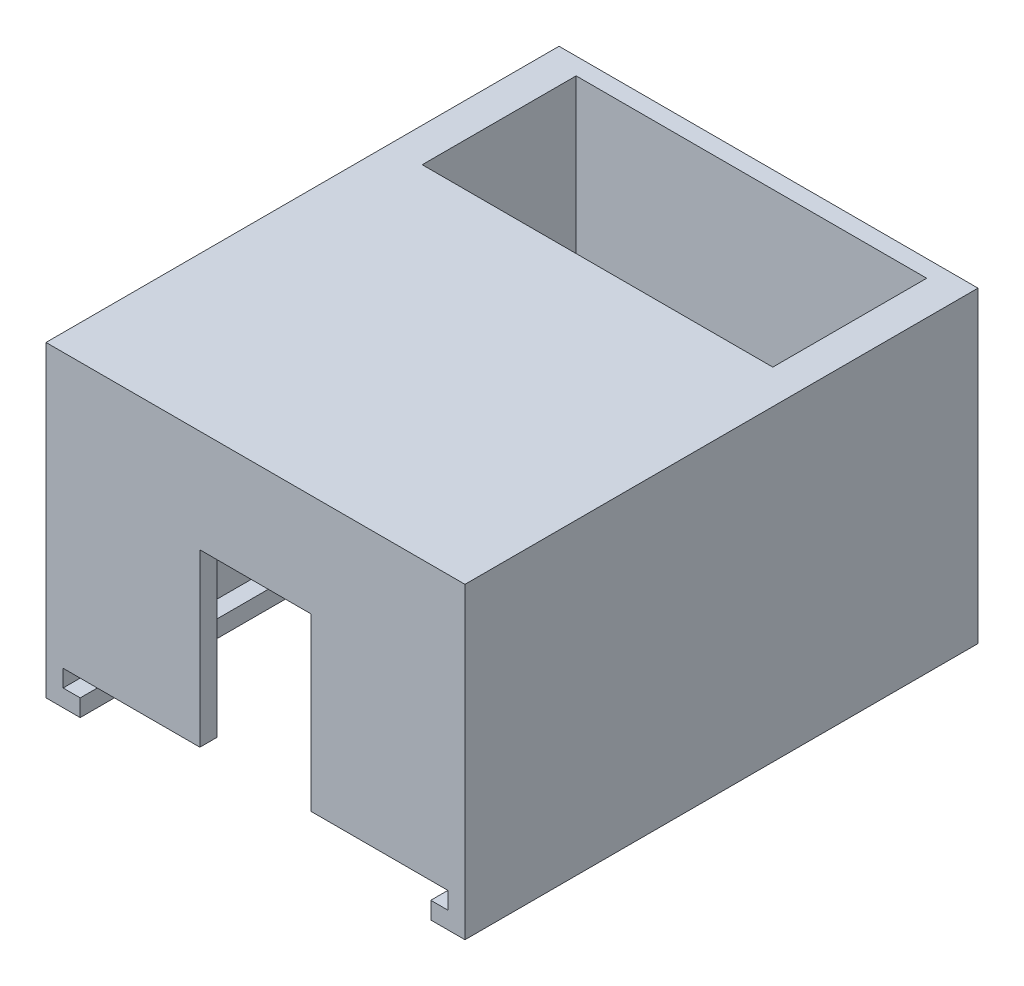
ISO-10303-21;
HEADER;
FILE_DESCRIPTION(('STEP AP214'),'2;1');
FILE_NAME('part.step','',(''),(''),'','','');
FILE_SCHEMA(('AUTOMOTIVE_DESIGN { 1 0 10303 214 1 1 1 1 }'));
ENDSEC;
DATA;
#1=APPLICATION_CONTEXT('core data for automotive mechanical design processes');
#2=APPLICATION_PROTOCOL_DEFINITION('international standard','automotive_design',2000,#1);
#3=PRODUCT_CONTEXT('',#1,'mechanical');
#4=PRODUCT('Part','Part','',(#3));
#5=PRODUCT_RELATED_PRODUCT_CATEGORY('part','',(#4));
#6=PRODUCT_DEFINITION_FORMATION('','',#4);
#7=PRODUCT_DEFINITION_CONTEXT('part definition',#1,'design');
#8=PRODUCT_DEFINITION('design','',#6,#7);
#9=PRODUCT_DEFINITION_SHAPE('','',#8);
#10=(LENGTH_UNIT() NAMED_UNIT(*) SI_UNIT(.MILLI.,.METRE.));
#11=(NAMED_UNIT(*) PLANE_ANGLE_UNIT() SI_UNIT($,.RADIAN.));
#12=(NAMED_UNIT(*) SI_UNIT($,.STERADIAN.) SOLID_ANGLE_UNIT());
#13=UNCERTAINTY_MEASURE_WITH_UNIT(LENGTH_MEASURE(1.E-05),#10,'distance_accuracy_value','');
#14=(GEOMETRIC_REPRESENTATION_CONTEXT(3) GLOBAL_UNCERTAINTY_ASSIGNED_CONTEXT((#13)) GLOBAL_UNIT_ASSIGNED_CONTEXT((#10,
#11,#12)) REPRESENTATION_CONTEXT('',''));
#15=CARTESIAN_POINT('',(0.,0.,0.));
#16=DIRECTION('',(0.,0.,1.));
#17=DIRECTION('',(1.,0.,0.));
#18=AXIS2_PLACEMENT_3D('',#15,#16,#17);
#19=CARTESIAN_POINT('',(1.,2.,30.));
#20=DIRECTION('',(0.,1.,0.));
#21=DIRECTION('',(-1.,0.,0.));
#22=AXIS2_PLACEMENT_3D('',#19,#20,#21);
#23=PLANE('',#22);
#24=DIRECTION('',(1.,0.,0.));
#25=VECTOR('',#24,1.);
#26=CARTESIAN_POINT('',(2.,2.,29.));
#27=LINE('',#26,#25);
#28=CARTESIAN_POINT('',(2.,2.,29.));
#29=VERTEX_POINT('',#28);
#30=CARTESIAN_POINT('',(9.,2.,29.));
#31=VERTEX_POINT('',#30);
#32=EDGE_CURVE('E247',#29,#31,#27,.T.);
#33=ORIENTED_EDGE('',*,*,#32,.T.);
#34=DIRECTION('',(0.,0.,1.));
#35=VECTOR('',#34,1.);
#36=CARTESIAN_POINT('',(9.,2.,29.));
#37=LINE('',#36,#35);
#38=CARTESIAN_POINT('',(9.,2.,30.));
#39=VERTEX_POINT('',#38);
#40=EDGE_CURVE('E236',#31,#39,#37,.T.);
#41=ORIENTED_EDGE('',*,*,#40,.T.);
#42=DIRECTION('',(1.,0.,0.));
#43=VECTOR('',#42,1.);
#44=CARTESIAN_POINT('',(1.,2.,30.));
#45=LINE('',#44,#43);
#46=CARTESIAN_POINT('',(1.,2.,30.));
#47=VERTEX_POINT('',#46);
#48=EDGE_CURVE('E299',#47,#39,#45,.T.);
#49=ORIENTED_EDGE('',*,*,#48,.F.);
#50=DIRECTION('',(0.,0.,1.));
#51=VECTOR('',#50,1.);
#52=CARTESIAN_POINT('',(1.,2.,2.));
#53=LINE('',#52,#51);
#54=CARTESIAN_POINT('',(1.,2.,1.));
#55=VERTEX_POINT('',#54);
#56=EDGE_CURVE('E282',#55,#47,#53,.T.);
#57=ORIENTED_EDGE('',*,*,#56,.F.);
#58=DIRECTION('',(1.,0.,0.));
#59=VECTOR('',#58,1.);
#60=CARTESIAN_POINT('',(1.,2.,1.));
#61=LINE('',#60,#59);
#62=CARTESIAN_POINT('',(2.,2.,1.));
#63=VERTEX_POINT('',#62);
#64=EDGE_CURVE('E290',#55,#63,#61,.T.);
#65=ORIENTED_EDGE('',*,*,#64,.T.);
#66=DIRECTION('',(0.,0.,1.));
#67=VECTOR('',#66,1.);
#68=CARTESIAN_POINT('',(2.,2.,30.));
#69=LINE('',#68,#67);
#70=EDGE_CURVE('E195',#63,#29,#69,.T.);
#71=ORIENTED_EDGE('',*,*,#70,.T.);
#72=EDGE_LOOP('',(#33,#41,#49,#57,#65,#71));
#73=FACE_BOUND('',#72,.T.);
#74=ADVANCED_FACE('F34',(#73),#23,.F.);
#75=CARTESIAN_POINT('',(22.5,17.,120.889049673131));
#76=DIRECTION('',(-1.,0.,0.));
#77=DIRECTION('',(0.,-1.,0.));
#78=AXIS2_PLACEMENT_3D('',#75,#76,#77);
#79=PLANE('',#78);
#80=DIRECTION('',(0.,0.,-1.));
#81=VECTOR('',#80,1.);
#82=CARTESIAN_POINT('',(22.5,2.,30.));
#83=LINE('',#82,#81);
#84=CARTESIAN_POINT('',(22.5,2.,29.));
#85=VERTEX_POINT('',#84);
#86=CARTESIAN_POINT('',(22.5,2.,1.));
#87=VERTEX_POINT('',#86);
#88=EDGE_CURVE('E261',#85,#87,#83,.T.);
#89=ORIENTED_EDGE('',*,*,#88,.F.);
#90=DIRECTION('',(0.,1.,0.));
#91=VECTOR('',#90,1.);
#92=CARTESIAN_POINT('',(22.5,17.,29.));
#93=LINE('',#92,#91);
#94=CARTESIAN_POINT('',(22.5,17.,29.));
#95=VERTEX_POINT('',#94);
#96=EDGE_CURVE('E250',#85,#95,#93,.T.);
#97=ORIENTED_EDGE('',*,*,#96,.T.);
#98=DIRECTION('',(0.,0.,-1.));
#99=VECTOR('',#98,1.);
#100=CARTESIAN_POINT('',(22.5,17.,120.889049673131));
#101=LINE('',#100,#99);
#102=CARTESIAN_POINT('',(22.5,17.,9.99999999999999));
#103=VERTEX_POINT('',#102);
#104=EDGE_CURVE('E315',#95,#103,#101,.T.);
#105=ORIENTED_EDGE('',*,*,#104,.T.);
#106=DIRECTION('',(0.,-1.,0.));
#107=VECTOR('',#106,1.);
#108=CARTESIAN_POINT('',(22.5,18.,10.));
#109=LINE('',#108,#107);
#110=CARTESIAN_POINT('',(22.5,18.,10.));
#111=VERTEX_POINT('',#110);
#112=EDGE_CURVE('E49',#111,#103,#109,.T.);
#113=ORIENTED_EDGE('',*,*,#112,.F.);
#114=DIRECTION('',(0.,0.,1.));
#115=VECTOR('',#114,1.);
#116=CARTESIAN_POINT('',(22.5,18.,1.));
#117=LINE('',#116,#115);
#118=CARTESIAN_POINT('',(22.5,18.,1.));
#119=VERTEX_POINT('',#118);
#120=EDGE_CURVE('E204',#119,#111,#117,.T.);
#121=ORIENTED_EDGE('',*,*,#120,.F.);
#122=DIRECTION('',(0.,-1.,0.));
#123=VECTOR('',#122,1.);
#124=CARTESIAN_POINT('',(22.5,17.,1.));
#125=LINE('',#124,#123);
#126=EDGE_CURVE('E57',#119,#87,#125,.T.);
#127=ORIENTED_EDGE('',*,*,#126,.T.);
#128=EDGE_LOOP('',(#89,#97,#105,#113,#121,#127));
#129=FACE_BOUND('',#128,.T.);
#130=ADVANCED_FACE('F427',(#129),#79,.T.);
#131=CARTESIAN_POINT('',(2.,17.,120.889049673131));
#132=DIRECTION('',(1.,0.,0.));
#133=DIRECTION('',(0.,1.,0.));
#134=AXIS2_PLACEMENT_3D('',#131,#132,#133);
#135=PLANE('',#134);
#136=DIRECTION('',(0.,0.,-1.));
#137=VECTOR('',#136,1.);
#138=CARTESIAN_POINT('',(2.,17.,120.889049673131));
#139=LINE('',#138,#137);
#140=CARTESIAN_POINT('',(2.,17.,29.));
#141=VERTEX_POINT('',#140);
#142=CARTESIAN_POINT('',(2.,17.,10.));
#143=VERTEX_POINT('',#142);
#144=EDGE_CURVE('E321',#141,#143,#139,.T.);
#145=ORIENTED_EDGE('',*,*,#144,.F.);
#146=DIRECTION('',(0.,-1.,0.));
#147=VECTOR('',#146,1.);
#148=CARTESIAN_POINT('',(2.,17.,29.));
#149=LINE('',#148,#147);
#150=EDGE_CURVE('E239',#141,#29,#149,.T.);
#151=ORIENTED_EDGE('',*,*,#150,.T.);
#152=ORIENTED_EDGE('',*,*,#70,.F.);
#153=DIRECTION('',(0.,1.,0.));
#154=VECTOR('',#153,1.);
#155=CARTESIAN_POINT('',(2.,17.,1.));
#156=LINE('',#155,#154);
#157=CARTESIAN_POINT('',(2.,18.,1.));
#158=VERTEX_POINT('',#157);
#159=EDGE_CURVE('E187',#63,#158,#156,.T.);
#160=ORIENTED_EDGE('',*,*,#159,.T.);
#161=DIRECTION('',(0.,0.,-1.));
#162=VECTOR('',#161,1.);
#163=CARTESIAN_POINT('',(2.,18.,1.));
#164=LINE('',#163,#162);
#165=CARTESIAN_POINT('',(2.,18.,10.));
#166=VERTEX_POINT('',#165);
#167=EDGE_CURVE('E191',#166,#158,#164,.T.);
#168=ORIENTED_EDGE('',*,*,#167,.F.);
#169=DIRECTION('',(0.,-1.,0.));
#170=VECTOR('',#169,1.);
#171=CARTESIAN_POINT('',(2.,18.,10.));
#172=LINE('',#171,#170);
#173=EDGE_CURVE('E215',#166,#143,#172,.T.);
#174=ORIENTED_EDGE('',*,*,#173,.T.);
#175=EDGE_LOOP('',(#145,#151,#152,#160,#168,#174));
#176=FACE_BOUND('',#175,.T.);
#177=ADVANCED_FACE('F189',(#176),#135,.T.);
#178=CARTESIAN_POINT('',(2.,17.,120.889049673131));
#179=DIRECTION('',(0.,-1.,0.));
#180=DIRECTION('',(0.,0.,-1.));
#181=AXIS2_PLACEMENT_3D('',#178,#179,#180);
#182=PLANE('',#181);
#183=DIRECTION('',(-1.,0.,0.));
#184=VECTOR('',#183,1.);
#185=CARTESIAN_POINT('',(2.,17.,10.));
#186=LINE('',#185,#184);
#187=EDGE_CURVE('E209',#103,#143,#186,.T.);
#188=ORIENTED_EDGE('',*,*,#187,.F.);
#189=ORIENTED_EDGE('',*,*,#104,.F.);
#190=DIRECTION('',(-1.,0.,0.));
#191=VECTOR('',#190,1.);
#192=CARTESIAN_POINT('',(2.,17.,29.));
#193=LINE('',#192,#191);
#194=EDGE_CURVE('E253',#95,#141,#193,.T.);
#195=ORIENTED_EDGE('',*,*,#194,.T.);
#196=ORIENTED_EDGE('',*,*,#144,.T.);
#197=EDGE_LOOP('',(#188,#189,#195,#196));
#198=FACE_BOUND('',#197,.T.);
#199=ADVANCED_FACE('F460',(#198),#182,.T.);
#200=DIRECTION('',(0.,0.,-1.));
#201=VECTOR('',#200,1.);
#202=CARTESIAN_POINT('',(2.,1.,1.));
#203=LINE('',#202,#201);
#204=CARTESIAN_POINT('',(2.,0.999999999999997,30.));
#205=VERTEX_POINT('',#204);
#206=CARTESIAN_POINT('',(2.,0.999999999999997,1.));
#207=VERTEX_POINT('',#206);
#208=EDGE_CURVE('E283',#205,#207,#203,.T.);
#209=ORIENTED_EDGE('',*,*,#208,.F.);
#210=DIRECTION('',(0.,1.,0.));
#211=VECTOR('',#210,1.);
#212=CARTESIAN_POINT('',(2.,17.,30.));
#213=LINE('',#212,#211);
#214=CARTESIAN_POINT('',(2.,0.,30.));
#215=VERTEX_POINT('',#214);
#216=EDGE_CURVE('E308',#215,#205,#213,.T.);
#217=ORIENTED_EDGE('',*,*,#216,.F.);
#218=DIRECTION('',(0.,0.,-1.));
#219=VECTOR('',#218,1.);
#220=CARTESIAN_POINT('',(2.,0.,120.889049673131));
#221=LINE('',#220,#219);
#222=CARTESIAN_POINT('',(2.,0.,1.));
#223=VERTEX_POINT('',#222);
#224=EDGE_CURVE('E318',#215,#223,#221,.T.);
#225=ORIENTED_EDGE('',*,*,#224,.T.);
#226=EDGE_CURVE('E196',#223,#207,#156,.T.);
#227=ORIENTED_EDGE('',*,*,#226,.T.);
#228=EDGE_LOOP('',(#209,#217,#225,#227));
#229=FACE_BOUND('',#228,.T.);
#230=ADVANCED_FACE('F383',(#229),#135,.T.);
#231=CARTESIAN_POINT('',(0.,0.,30.));
#232=DIRECTION('',(0.,1.,0.));
#233=DIRECTION('',(0.,0.,1.));
#234=AXIS2_PLACEMENT_3D('',#231,#232,#233);
#235=PLANE('',#234);
#236=ORIENTED_EDGE('',*,*,#224,.F.);
#237=DIRECTION('',(1.,0.,0.));
#238=VECTOR('',#237,1.);
#239=CARTESIAN_POINT('',(0.,0.,30.));
#240=LINE('',#239,#238);
#241=CARTESIAN_POINT('',(0.,0.,30.));
#242=VERTEX_POINT('',#241);
#243=EDGE_CURVE('E331',#242,#215,#240,.T.);
#244=ORIENTED_EDGE('',*,*,#243,.F.);
#245=DIRECTION('',(0.,0.,-1.));
#246=VECTOR('',#245,1.);
#247=CARTESIAN_POINT('',(0.,0.,30.));
#248=LINE('',#247,#246);
#249=CARTESIAN_POINT('',(0.,0.,0.));
#250=VERTEX_POINT('',#249);
#251=EDGE_CURVE('E11',#242,#250,#248,.T.);
#252=ORIENTED_EDGE('',*,*,#251,.T.);
#253=DIRECTION('',(1.,0.,0.));
#254=VECTOR('',#253,1.);
#255=CARTESIAN_POINT('',(0.,0.,0.));
#256=LINE('',#255,#254);
#257=CARTESIAN_POINT('',(24.5,0.,0.));
#258=VERTEX_POINT('',#257);
#259=EDGE_CURVE('E341',#250,#258,#256,.T.);
#260=ORIENTED_EDGE('',*,*,#259,.T.);
#261=DIRECTION('',(0.,0.,-1.));
#262=VECTOR('',#261,1.);
#263=CARTESIAN_POINT('',(24.5,0.,30.));
#264=LINE('',#263,#262);
#265=CARTESIAN_POINT('',(24.5,0.,30.));
#266=VERTEX_POINT('',#265);
#267=EDGE_CURVE('E42',#266,#258,#264,.T.);
#268=ORIENTED_EDGE('',*,*,#267,.F.);
#269=CARTESIAN_POINT('',(22.5,0.,30.));
#270=VERTEX_POINT('',#269);
#271=EDGE_CURVE('E329',#270,#266,#240,.T.);
#272=ORIENTED_EDGE('',*,*,#271,.F.);
#273=DIRECTION('',(0.,0.,-1.));
#274=VECTOR('',#273,1.);
#275=CARTESIAN_POINT('',(22.5,0.,120.889049673131));
#276=LINE('',#275,#274);
#277=CARTESIAN_POINT('',(22.5,0.,1.));
#278=VERTEX_POINT('',#277);
#279=EDGE_CURVE('E305',#270,#278,#276,.T.);
#280=ORIENTED_EDGE('',*,*,#279,.T.);
#281=DIRECTION('',(1.,0.,0.));
#282=VECTOR('',#281,1.);
#283=CARTESIAN_POINT('',(0.,0.,1.));
#284=LINE('',#283,#282);
#285=EDGE_CURVE('E296',#223,#278,#284,.T.);
#286=ORIENTED_EDGE('',*,*,#285,.F.);
#287=EDGE_LOOP('',(#236,#244,#252,#260,#268,#272,#280,#286));
#288=FACE_BOUND('',#287,.T.);
#289=ADVANCED_FACE('F373',(#288),#235,.F.);
#290=CARTESIAN_POINT('',(0.,0.,30.));
#291=DIRECTION('',(0.,0.,-1.));
#292=DIRECTION('',(-1.,0.,0.));
#293=AXIS2_PLACEMENT_3D('',#290,#291,#292);
#294=PLANE('',#293);
#295=ORIENTED_EDGE('',*,*,#48,.T.);
#296=DIRECTION('',(0.,-1.,0.));
#297=VECTOR('',#296,1.);
#298=CARTESIAN_POINT('',(9.,2.,30.));
#299=LINE('',#298,#297);
#300=CARTESIAN_POINT('',(9.,12.,30.));
#301=VERTEX_POINT('',#300);
#302=EDGE_CURVE('E223',#301,#39,#299,.T.);
#303=ORIENTED_EDGE('',*,*,#302,.F.);
#304=DIRECTION('',(-1.,0.,0.));
#305=VECTOR('',#304,1.);
#306=CARTESIAN_POINT('',(9.,12.,30.));
#307=LINE('',#306,#305);
#308=CARTESIAN_POINT('',(15.5,12.,30.));
#309=VERTEX_POINT('',#308);
#310=EDGE_CURVE('E232',#309,#301,#307,.T.);
#311=ORIENTED_EDGE('',*,*,#310,.F.);
#312=DIRECTION('',(0.,1.,0.));
#313=VECTOR('',#312,1.);
#314=CARTESIAN_POINT('',(15.5,12.,30.));
#315=LINE('',#314,#313);
#316=CARTESIAN_POINT('',(15.5,2.,30.));
#317=VERTEX_POINT('',#316);
#318=EDGE_CURVE('E217',#317,#309,#315,.T.);
#319=ORIENTED_EDGE('',*,*,#318,.F.);
#320=CARTESIAN_POINT('',(23.5,2.,30.));
#321=VERTEX_POINT('',#320);
#322=EDGE_CURVE('E302',#317,#321,#45,.T.);
#323=ORIENTED_EDGE('',*,*,#322,.T.);
#324=DIRECTION('',(0.,1.,0.));
#325=VECTOR('',#324,1.);
#326=CARTESIAN_POINT('',(23.5,1.,30.));
#327=LINE('',#326,#325);
#328=CARTESIAN_POINT('',(23.5,1.,30.));
#329=VERTEX_POINT('',#328);
#330=EDGE_CURVE('E264',#329,#321,#327,.T.);
#331=ORIENTED_EDGE('',*,*,#330,.F.);
#332=DIRECTION('',(-1.,0.,0.));
#333=VECTOR('',#332,1.);
#334=CARTESIAN_POINT('',(23.5,1.,30.));
#335=LINE('',#334,#333);
#336=CARTESIAN_POINT('',(22.5,1.,30.));
#337=VERTEX_POINT('',#336);
#338=EDGE_CURVE('E275',#329,#337,#335,.T.);
#339=ORIENTED_EDGE('',*,*,#338,.T.);
#340=DIRECTION('',(0.,-1.,0.));
#341=VECTOR('',#340,1.);
#342=CARTESIAN_POINT('',(22.5,17.,30.));
#343=LINE('',#342,#341);
#344=EDGE_CURVE('E311',#337,#270,#343,.T.);
#345=ORIENTED_EDGE('',*,*,#344,.T.);
#346=ORIENTED_EDGE('',*,*,#271,.T.);
#347=DIRECTION('',(0.,1.,0.));
#348=VECTOR('',#347,1.);
#349=CARTESIAN_POINT('',(24.5,0.,30.));
#350=LINE('',#349,#348);
#351=CARTESIAN_POINT('',(24.5,18.,30.));
#352=VERTEX_POINT('',#351);
#353=EDGE_CURVE('E334',#266,#352,#350,.T.);
#354=ORIENTED_EDGE('',*,*,#353,.T.);
#355=DIRECTION('',(-1.,0.,0.));
#356=VECTOR('',#355,1.);
#357=CARTESIAN_POINT('',(0.,18.,30.));
#358=LINE('',#357,#356);
#359=CARTESIAN_POINT('',(0.,18.,30.));
#360=VERTEX_POINT('',#359);
#361=EDGE_CURVE('E336',#352,#360,#358,.T.);
#362=ORIENTED_EDGE('',*,*,#361,.T.);
#363=DIRECTION('',(0.,-1.,0.));
#364=VECTOR('',#363,1.);
#365=CARTESIAN_POINT('',(0.,0.,30.));
#366=LINE('',#365,#364);
#367=EDGE_CURVE('E326',#360,#242,#366,.T.);
#368=ORIENTED_EDGE('',*,*,#367,.T.);
#369=ORIENTED_EDGE('',*,*,#243,.T.);
#370=ORIENTED_EDGE('',*,*,#216,.T.);
#371=DIRECTION('',(1.,0.,0.));
#372=VECTOR('',#371,1.);
#373=CARTESIAN_POINT('',(1.,0.999999999999997,30.));
#374=LINE('',#373,#372);
#375=CARTESIAN_POINT('',(1.,0.999999999999997,30.));
#376=VERTEX_POINT('',#375);
#377=EDGE_CURVE('E297',#376,#205,#374,.T.);
#378=ORIENTED_EDGE('',*,*,#377,.F.);
#379=DIRECTION('',(0.,-1.,0.));
#380=VECTOR('',#379,1.);
#381=CARTESIAN_POINT('',(1.,0.999999999999997,30.));
#382=LINE('',#381,#380);
#383=EDGE_CURVE('E285',#47,#376,#382,.T.);
#384=ORIENTED_EDGE('',*,*,#383,.F.);
#385=EDGE_LOOP('',(#295,#303,#311,#319,#323,#331,#339,#345,#346,#354,#362,#368,#369,#370,#378,#384));
#386=FACE_BOUND('',#385,.T.);
#387=ADVANCED_FACE('F369',(#386),#294,.F.);
#388=CARTESIAN_POINT('',(0.,0.,30.));
#389=DIRECTION('',(1.,0.,0.));
#390=DIRECTION('',(0.,0.,-1.));
#391=AXIS2_PLACEMENT_3D('',#388,#389,#390);
#392=PLANE('',#391);
#393=DIRECTION('',(0.,-1.,0.));
#394=VECTOR('',#393,1.);
#395=CARTESIAN_POINT('',(0.,0.,0.));
#396=LINE('',#395,#394);
#397=CARTESIAN_POINT('',(0.,18.,0.));
#398=VERTEX_POINT('',#397);
#399=EDGE_CURVE('E324',#398,#250,#396,.T.);
#400=ORIENTED_EDGE('',*,*,#399,.T.);
#401=ORIENTED_EDGE('',*,*,#251,.F.);
#402=ORIENTED_EDGE('',*,*,#367,.F.);
#403=DIRECTION('',(0.,0.,-1.));
#404=VECTOR('',#403,1.);
#405=CARTESIAN_POINT('',(0.,18.,30.));
#406=LINE('',#405,#404);
#407=EDGE_CURVE('E338',#360,#398,#406,.T.);
#408=ORIENTED_EDGE('',*,*,#407,.T.);
#409=EDGE_LOOP('',(#400,#401,#402,#408));
#410=FACE_BOUND('',#409,.T.);
#411=ADVANCED_FACE('F36',(#410),#392,.F.);
#412=CARTESIAN_POINT('',(24.5,0.,30.));
#413=DIRECTION('',(-1.,0.,0.));
#414=DIRECTION('',(0.,0.,1.));
#415=AXIS2_PLACEMENT_3D('',#412,#413,#414);
#416=PLANE('',#415);
#417=DIRECTION('',(0.,1.,0.));
#418=VECTOR('',#417,1.);
#419=CARTESIAN_POINT('',(24.5,0.,0.));
#420=LINE('',#419,#418);
#421=CARTESIAN_POINT('',(24.5,18.,0.));
#422=VERTEX_POINT('',#421);
#423=EDGE_CURVE('E343',#258,#422,#420,.T.);
#424=ORIENTED_EDGE('',*,*,#423,.T.);
#425=DIRECTION('',(0.,0.,-1.));
#426=VECTOR('',#425,1.);
#427=CARTESIAN_POINT('',(24.5,18.,30.));
#428=LINE('',#427,#426);
#429=EDGE_CURVE('E348',#352,#422,#428,.T.);
#430=ORIENTED_EDGE('',*,*,#429,.F.);
#431=ORIENTED_EDGE('',*,*,#353,.F.);
#432=ORIENTED_EDGE('',*,*,#267,.T.);
#433=EDGE_LOOP('',(#424,#430,#431,#432));
#434=FACE_BOUND('',#433,.T.);
#435=ADVANCED_FACE('F355',(#434),#416,.F.);
#436=CARTESIAN_POINT('',(0.,18.,30.));
#437=DIRECTION('',(0.,-1.,0.));
#438=DIRECTION('',(0.,0.,-1.));
#439=AXIS2_PLACEMENT_3D('',#436,#437,#438);
#440=PLANE('',#439);
#441=DIRECTION('',(-1.,0.,0.));
#442=VECTOR('',#441,1.);
#443=CARTESIAN_POINT('',(2.,18.,10.));
#444=LINE('',#443,#442);
#445=EDGE_CURVE('E208',#111,#166,#444,.T.);
#446=ORIENTED_EDGE('',*,*,#445,.T.);
#447=ORIENTED_EDGE('',*,*,#167,.T.);
#448=DIRECTION('',(1.,0.,0.));
#449=VECTOR('',#448,1.);
#450=CARTESIAN_POINT('',(2.,18.,1.));
#451=LINE('',#450,#449);
#452=EDGE_CURVE('E199',#158,#119,#451,.T.);
#453=ORIENTED_EDGE('',*,*,#452,.T.);
#454=ORIENTED_EDGE('',*,*,#120,.T.);
#455=EDGE_LOOP('',(#446,#447,#453,#454));
#456=FACE_BOUND('',#455,.T.);
#457=DIRECTION('',(-1.,0.,0.));
#458=VECTOR('',#457,1.);
#459=CARTESIAN_POINT('',(0.,18.,0.));
#460=LINE('',#459,#458);
#461=EDGE_CURVE('E330',#422,#398,#460,.T.);
#462=ORIENTED_EDGE('',*,*,#461,.T.);
#463=ORIENTED_EDGE('',*,*,#407,.F.);
#464=ORIENTED_EDGE('',*,*,#361,.F.);
#465=ORIENTED_EDGE('',*,*,#429,.T.);
#466=EDGE_LOOP('',(#462,#463,#464,#465));
#467=FACE_BOUND('',#466,.T.);
#468=ADVANCED_FACE('F206',(#456,#467),#440,.F.);
#469=CARTESIAN_POINT('',(0.,0.,0.));
#470=DIRECTION('',(0.,0.,-1.));
#471=DIRECTION('',(-1.,0.,0.));
#472=AXIS2_PLACEMENT_3D('',#469,#470,#471);
#473=PLANE('',#472);
#474=ORIENTED_EDGE('',*,*,#399,.F.);
#475=ORIENTED_EDGE('',*,*,#461,.F.);
#476=ORIENTED_EDGE('',*,*,#423,.F.);
#477=ORIENTED_EDGE('',*,*,#259,.F.);
#478=EDGE_LOOP('',(#474,#475,#476,#477));
#479=FACE_BOUND('',#478,.T.);
#480=ADVANCED_FACE('F362',(#479),#473,.T.);
#481=DIRECTION('',(0.,0.,1.));
#482=VECTOR('',#481,1.);
#483=CARTESIAN_POINT('',(22.5,0.999999999999999,1.));
#484=LINE('',#483,#482);
#485=CARTESIAN_POINT('',(22.5,0.999999999999999,1.));
#486=VERTEX_POINT('',#485);
#487=EDGE_CURVE('E256',#486,#337,#484,.T.);
#488=ORIENTED_EDGE('',*,*,#487,.F.);
#489=EDGE_CURVE('E307',#486,#278,#125,.T.);
#490=ORIENTED_EDGE('',*,*,#489,.T.);
#491=ORIENTED_EDGE('',*,*,#279,.F.);
#492=ORIENTED_EDGE('',*,*,#344,.F.);
#493=EDGE_LOOP('',(#488,#490,#491,#492));
#494=FACE_BOUND('',#493,.T.);
#495=ADVANCED_FACE('F376',(#494),#79,.T.);
#496=CARTESIAN_POINT('',(0.,0.,1.));
#497=DIRECTION('',(0.,0.,-1.));
#498=DIRECTION('',(-1.,0.,0.));
#499=AXIS2_PLACEMENT_3D('',#496,#497,#498);
#500=PLANE('',#499);
#501=ORIENTED_EDGE('',*,*,#285,.T.);
#502=ORIENTED_EDGE('',*,*,#489,.F.);
#503=DIRECTION('',(-1.,0.,0.));
#504=VECTOR('',#503,1.);
#505=CARTESIAN_POINT('',(23.5,0.999999999999999,1.));
#506=LINE('',#505,#504);
#507=CARTESIAN_POINT('',(23.5,0.999999999999999,1.));
#508=VERTEX_POINT('',#507);
#509=EDGE_CURVE('E270',#508,#486,#506,.T.);
#510=ORIENTED_EDGE('',*,*,#509,.F.);
#511=DIRECTION('',(0.,-1.,0.));
#512=VECTOR('',#511,1.);
#513=CARTESIAN_POINT('',(23.5,2.,1.));
#514=LINE('',#513,#512);
#515=CARTESIAN_POINT('',(23.5,2.,1.));
#516=VERTEX_POINT('',#515);
#517=EDGE_CURVE('E257',#516,#508,#514,.T.);
#518=ORIENTED_EDGE('',*,*,#517,.F.);
#519=DIRECTION('',(-1.,0.,0.));
#520=VECTOR('',#519,1.);
#521=CARTESIAN_POINT('',(23.5,2.,1.));
#522=LINE('',#521,#520);
#523=EDGE_CURVE('E273',#516,#87,#522,.T.);
#524=ORIENTED_EDGE('',*,*,#523,.T.);
#525=ORIENTED_EDGE('',*,*,#126,.F.);
#526=ORIENTED_EDGE('',*,*,#452,.F.);
#527=ORIENTED_EDGE('',*,*,#159,.F.);
#528=ORIENTED_EDGE('',*,*,#64,.F.);
#529=DIRECTION('',(0.,1.,0.));
#530=VECTOR('',#529,1.);
#531=CARTESIAN_POINT('',(1.,2.,1.));
#532=LINE('',#531,#530);
#533=CARTESIAN_POINT('',(1.,1.,1.));
#534=VERTEX_POINT('',#533);
#535=EDGE_CURVE('E279',#534,#55,#532,.T.);
#536=ORIENTED_EDGE('',*,*,#535,.F.);
#537=DIRECTION('',(1.,0.,0.));
#538=VECTOR('',#537,1.);
#539=CARTESIAN_POINT('',(1.,1.,1.));
#540=LINE('',#539,#538);
#541=EDGE_CURVE('E293',#534,#207,#540,.T.);
#542=ORIENTED_EDGE('',*,*,#541,.T.);
#543=ORIENTED_EDGE('',*,*,#226,.F.);
#544=EDGE_LOOP('',(#501,#502,#510,#518,#524,#525,#526,#527,#528,#536,#542,#543));
#545=FACE_BOUND('',#544,.T.);
#546=ADVANCED_FACE('F201',(#545),#500,.F.);
#547=CARTESIAN_POINT('',(1.,1.,1.));
#548=DIRECTION('',(0.,-1.,0.));
#549=DIRECTION('',(0.,0.,-1.));
#550=AXIS2_PLACEMENT_3D('',#547,#548,#549);
#551=PLANE('',#550);
#552=ORIENTED_EDGE('',*,*,#208,.T.);
#553=ORIENTED_EDGE('',*,*,#541,.F.);
#554=DIRECTION('',(0.,0.,-1.));
#555=VECTOR('',#554,1.);
#556=CARTESIAN_POINT('',(1.,1.,1.));
#557=LINE('',#556,#555);
#558=EDGE_CURVE('E287',#376,#534,#557,.T.);
#559=ORIENTED_EDGE('',*,*,#558,.F.);
#560=ORIENTED_EDGE('',*,*,#377,.T.);
#561=EDGE_LOOP('',(#552,#553,#559,#560));
#562=FACE_BOUND('',#561,.T.);
#563=ADVANCED_FACE('F388',(#562),#551,.F.);
#564=ORIENTED_EDGE('',*,*,#322,.F.);
#565=DIRECTION('',(0.,0.,1.));
#566=VECTOR('',#565,1.);
#567=CARTESIAN_POINT('',(15.5,2.,29.));
#568=LINE('',#567,#566);
#569=CARTESIAN_POINT('',(15.5,2.,29.));
#570=VERTEX_POINT('',#569);
#571=EDGE_CURVE('E229',#570,#317,#568,.T.);
#572=ORIENTED_EDGE('',*,*,#571,.F.);
#573=EDGE_CURVE('E246',#570,#85,#27,.T.);
#574=ORIENTED_EDGE('',*,*,#573,.T.);
#575=ORIENTED_EDGE('',*,*,#88,.T.);
#576=ORIENTED_EDGE('',*,*,#523,.F.);
#577=DIRECTION('',(0.,0.,-1.));
#578=VECTOR('',#577,1.);
#579=CARTESIAN_POINT('',(23.5,2.,30.));
#580=LINE('',#579,#578);
#581=EDGE_CURVE('E267',#321,#516,#580,.T.);
#582=ORIENTED_EDGE('',*,*,#581,.F.);
#583=EDGE_LOOP('',(#564,#572,#574,#575,#576,#582));
#584=FACE_BOUND('',#583,.T.);
#585=ADVANCED_FACE('F411',(#584),#23,.F.);
#586=CARTESIAN_POINT('',(1.,0.,0.));
#587=DIRECTION('',(-1.,0.,0.));
#588=DIRECTION('',(0.,0.,1.));
#589=AXIS2_PLACEMENT_3D('',#586,#587,#588);
#590=PLANE('',#589);
#591=ORIENTED_EDGE('',*,*,#535,.T.);
#592=ORIENTED_EDGE('',*,*,#56,.T.);
#593=ORIENTED_EDGE('',*,*,#383,.T.);
#594=ORIENTED_EDGE('',*,*,#558,.T.);
#595=EDGE_LOOP('',(#591,#592,#593,#594));
#596=FACE_BOUND('',#595,.T.);
#597=ADVANCED_FACE('F391',(#596),#590,.F.);
#598=CARTESIAN_POINT('',(23.5,0.999999999999999,1.));
#599=DIRECTION('',(0.,-1.,0.));
#600=DIRECTION('',(1.,0.,0.));
#601=AXIS2_PLACEMENT_3D('',#598,#599,#600);
#602=PLANE('',#601);
#603=ORIENTED_EDGE('',*,*,#487,.T.);
#604=ORIENTED_EDGE('',*,*,#338,.F.);
#605=DIRECTION('',(0.,0.,1.));
#606=VECTOR('',#605,1.);
#607=CARTESIAN_POINT('',(23.5,0.999999999999999,1.));
#608=LINE('',#607,#606);
#609=EDGE_CURVE('E260',#508,#329,#608,.T.);
#610=ORIENTED_EDGE('',*,*,#609,.F.);
#611=ORIENTED_EDGE('',*,*,#509,.T.);
#612=EDGE_LOOP('',(#603,#604,#610,#611));
#613=FACE_BOUND('',#612,.T.);
#614=ADVANCED_FACE('F416',(#613),#602,.F.);
#615=CARTESIAN_POINT('',(23.5,0.,0.));
#616=DIRECTION('',(-1.,0.,0.));
#617=DIRECTION('',(0.,0.,1.));
#618=AXIS2_PLACEMENT_3D('',#615,#616,#617);
#619=PLANE('',#618);
#620=ORIENTED_EDGE('',*,*,#517,.T.);
#621=ORIENTED_EDGE('',*,*,#609,.T.);
#622=ORIENTED_EDGE('',*,*,#330,.T.);
#623=ORIENTED_EDGE('',*,*,#581,.T.);
#624=EDGE_LOOP('',(#620,#621,#622,#623));
#625=FACE_BOUND('',#624,.T.);
#626=ADVANCED_FACE('F414',(#625),#619,.T.);
#627=CARTESIAN_POINT('',(0.,0.,29.));
#628=DIRECTION('',(0.,0.,1.));
#629=DIRECTION('',(1.,0.,0.));
#630=AXIS2_PLACEMENT_3D('',#627,#628,#629);
#631=PLANE('',#630);
#632=DIRECTION('',(-1.,0.,0.));
#633=VECTOR('',#632,1.);
#634=CARTESIAN_POINT('',(9.,12.,29.));
#635=LINE('',#634,#633);
#636=CARTESIAN_POINT('',(15.5,12.,29.));
#637=VERTEX_POINT('',#636);
#638=CARTESIAN_POINT('',(9.,12.,29.));
#639=VERTEX_POINT('',#638);
#640=EDGE_CURVE('E222',#637,#639,#635,.T.);
#641=ORIENTED_EDGE('',*,*,#640,.T.);
#642=DIRECTION('',(0.,-1.,0.));
#643=VECTOR('',#642,1.);
#644=CARTESIAN_POINT('',(9.,2.,29.));
#645=LINE('',#644,#643);
#646=EDGE_CURVE('E226',#639,#31,#645,.T.);
#647=ORIENTED_EDGE('',*,*,#646,.T.);
#648=ORIENTED_EDGE('',*,*,#32,.F.);
#649=ORIENTED_EDGE('',*,*,#150,.F.);
#650=ORIENTED_EDGE('',*,*,#194,.F.);
#651=ORIENTED_EDGE('',*,*,#96,.F.);
#652=ORIENTED_EDGE('',*,*,#573,.F.);
#653=DIRECTION('',(0.,1.,0.));
#654=VECTOR('',#653,1.);
#655=CARTESIAN_POINT('',(15.5,12.,29.));
#656=LINE('',#655,#654);
#657=EDGE_CURVE('E219',#570,#637,#656,.T.);
#658=ORIENTED_EDGE('',*,*,#657,.T.);
#659=EDGE_LOOP('',(#641,#647,#648,#649,#650,#651,#652,#658));
#660=FACE_BOUND('',#659,.T.);
#661=ADVANCED_FACE('F423',(#660),#631,.F.);
#662=CARTESIAN_POINT('',(9.,2.,29.));
#663=DIRECTION('',(-1.,0.,0.));
#664=DIRECTION('',(0.,0.,1.));
#665=AXIS2_PLACEMENT_3D('',#662,#663,#664);
#666=PLANE('',#665);
#667=ORIENTED_EDGE('',*,*,#302,.T.);
#668=ORIENTED_EDGE('',*,*,#40,.F.);
#669=ORIENTED_EDGE('',*,*,#646,.F.);
#670=DIRECTION('',(0.,0.,1.));
#671=VECTOR('',#670,1.);
#672=CARTESIAN_POINT('',(9.,12.,29.));
#673=LINE('',#672,#671);
#674=EDGE_CURVE('E240',#639,#301,#673,.T.);
#675=ORIENTED_EDGE('',*,*,#674,.T.);
#676=EDGE_LOOP('',(#667,#668,#669,#675));
#677=FACE_BOUND('',#676,.T.);
#678=ADVANCED_FACE('F399',(#677),#666,.F.);
#679=CARTESIAN_POINT('',(9.,12.,29.));
#680=DIRECTION('',(0.,1.,0.));
#681=DIRECTION('',(0.,0.,1.));
#682=AXIS2_PLACEMENT_3D('',#679,#680,#681);
#683=PLANE('',#682);
#684=ORIENTED_EDGE('',*,*,#310,.T.);
#685=ORIENTED_EDGE('',*,*,#674,.F.);
#686=ORIENTED_EDGE('',*,*,#640,.F.);
#687=DIRECTION('',(0.,0.,1.));
#688=VECTOR('',#687,1.);
#689=CARTESIAN_POINT('',(15.5,12.,29.));
#690=LINE('',#689,#688);
#691=EDGE_CURVE('E242',#637,#309,#690,.T.);
#692=ORIENTED_EDGE('',*,*,#691,.T.);
#693=EDGE_LOOP('',(#684,#685,#686,#692));
#694=FACE_BOUND('',#693,.T.);
#695=ADVANCED_FACE('F402',(#694),#683,.F.);
#696=CARTESIAN_POINT('',(15.5,12.,29.));
#697=DIRECTION('',(1.,0.,0.));
#698=DIRECTION('',(0.,0.,-1.));
#699=AXIS2_PLACEMENT_3D('',#696,#697,#698);
#700=PLANE('',#699);
#701=ORIENTED_EDGE('',*,*,#318,.T.);
#702=ORIENTED_EDGE('',*,*,#691,.F.);
#703=ORIENTED_EDGE('',*,*,#657,.F.);
#704=ORIENTED_EDGE('',*,*,#571,.T.);
#705=EDGE_LOOP('',(#701,#702,#703,#704));
#706=FACE_BOUND('',#705,.T.);
#707=ADVANCED_FACE('F405',(#706),#700,.F.);
#708=CARTESIAN_POINT('',(2.,18.,10.));
#709=DIRECTION('',(0.,0.,1.));
#710=DIRECTION('',(1.,0.,0.));
#711=AXIS2_PLACEMENT_3D('',#708,#709,#710);
#712=PLANE('',#711);
#713=ORIENTED_EDGE('',*,*,#187,.T.);
#714=ORIENTED_EDGE('',*,*,#173,.F.);
#715=ORIENTED_EDGE('',*,*,#445,.F.);
#716=ORIENTED_EDGE('',*,*,#112,.T.);
#717=EDGE_LOOP('',(#713,#714,#715,#716));
#718=FACE_BOUND('',#717,.T.);
#719=ADVANCED_FACE('F495',(#718),#712,.F.);
#720=CLOSED_SHELL('',(#74,#130,#177,#199,#230,#289,#387,#411,#435,#468,#480,#495,#546,#563,#585,
#597,#614,#626,#661,#678,#695,#707,#719));
#721=MANIFOLD_SOLID_BREP('B2',#720);
#722=ADVANCED_BREP_SHAPE_REPRESENTATION('',(#18,#721),#14);
#723=SHAPE_DEFINITION_REPRESENTATION(#9,#722);
ENDSEC;
END-ISO-10303-21;
